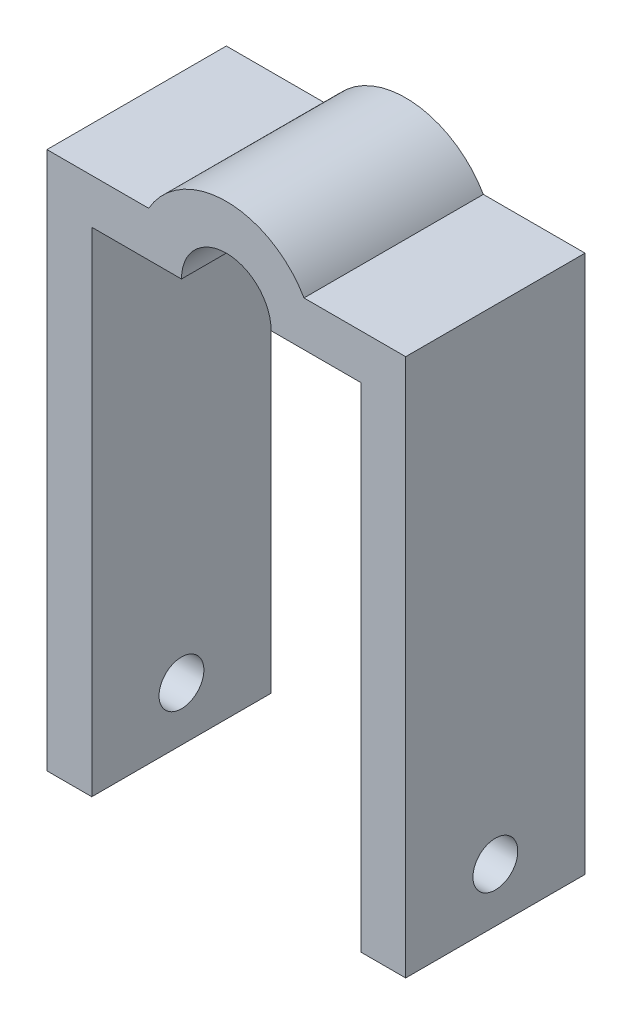
ISO-10303-21;
HEADER;
FILE_DESCRIPTION(('STEP AP214'),'2;1');
FILE_NAME('part.step','',(''),(''),'','','');
FILE_SCHEMA(('AUTOMOTIVE_DESIGN { 1 0 10303 214 1 1 1 1 }'));
ENDSEC;
DATA;
#1=APPLICATION_CONTEXT('core data for automotive mechanical design processes');
#2=APPLICATION_PROTOCOL_DEFINITION('international standard','automotive_design',2000,#1);
#3=PRODUCT_CONTEXT('',#1,'mechanical');
#4=PRODUCT('Part','Part','',(#3));
#5=PRODUCT_RELATED_PRODUCT_CATEGORY('part','',(#4));
#6=PRODUCT_DEFINITION_FORMATION('','',#4);
#7=PRODUCT_DEFINITION_CONTEXT('part definition',#1,'design');
#8=PRODUCT_DEFINITION('design','',#6,#7);
#9=PRODUCT_DEFINITION_SHAPE('','',#8);
#10=(LENGTH_UNIT() NAMED_UNIT(*) SI_UNIT(.MILLI.,.METRE.));
#11=(NAMED_UNIT(*) PLANE_ANGLE_UNIT() SI_UNIT($,.RADIAN.));
#12=(NAMED_UNIT(*) SI_UNIT($,.STERADIAN.) SOLID_ANGLE_UNIT());
#13=UNCERTAINTY_MEASURE_WITH_UNIT(LENGTH_MEASURE(1.E-05),#10,'distance_accuracy_value','');
#14=(GEOMETRIC_REPRESENTATION_CONTEXT(3) GLOBAL_UNCERTAINTY_ASSIGNED_CONTEXT((#13)) GLOBAL_UNIT_ASSIGNED_CONTEXT((#10,
#11,#12)) REPRESENTATION_CONTEXT('',''));
#15=CARTESIAN_POINT('',(0.,0.,0.));
#16=DIRECTION('',(0.,0.,1.));
#17=DIRECTION('',(1.,0.,0.));
#18=AXIS2_PLACEMENT_3D('',#15,#16,#17);
#19=CARTESIAN_POINT('',(-3.175,0.,12.7));
#20=DIRECTION('',(-1.,0.,0.));
#21=DIRECTION('',(0.,0.,1.));
#22=AXIS2_PLACEMENT_3D('',#19,#20,#21);
#23=PLANE('',#22);
#24=CARTESIAN_POINT('',(-3.175,3.81,6.35));
#25=DIRECTION('',(-1.,0.,0.));
#26=DIRECTION('',(0.,0.,1.));
#27=AXIS2_PLACEMENT_3D('',#24,#25,#26);
#28=CIRCLE('',#27,1.5875);
#29=CARTESIAN_POINT('',(-3.175,3.81,7.9375));
#30=VERTEX_POINT('',#29);
#31=EDGE_CURVE('E273',#30,#30,#28,.T.);
#32=ORIENTED_EDGE('',*,*,#31,.F.);
#33=EDGE_LOOP('',(#32));
#34=FACE_BOUND('',#33,.T.);
#35=DIRECTION('',(0.,1.,0.));
#36=VECTOR('',#35,1.);
#37=CARTESIAN_POINT('',(-3.175,0.,0.));
#38=LINE('',#37,#36);
#39=CARTESIAN_POINT('',(-3.175,0.,0.));
#40=VERTEX_POINT('',#39);
#41=CARTESIAN_POINT('',(-3.175,38.1,0.));
#42=VERTEX_POINT('',#41);
#43=EDGE_CURVE('E157',#40,#42,#38,.T.);
#44=ORIENTED_EDGE('',*,*,#43,.F.);
#45=DIRECTION('',(0.,0.,-1.));
#46=VECTOR('',#45,1.);
#47=CARTESIAN_POINT('',(-3.175,0.,12.7));
#48=LINE('',#47,#46);
#49=CARTESIAN_POINT('',(-3.175,0.,12.7));
#50=VERTEX_POINT('',#49);
#51=EDGE_CURVE('E11',#50,#40,#48,.T.);
#52=ORIENTED_EDGE('',*,*,#51,.F.);
#53=DIRECTION('',(0.,1.,0.));
#54=VECTOR('',#53,1.);
#55=CARTESIAN_POINT('',(-3.175,0.,12.7));
#56=LINE('',#55,#54);
#57=CARTESIAN_POINT('',(-3.175,38.1,12.7));
#58=VERTEX_POINT('',#57);
#59=EDGE_CURVE('E185',#50,#58,#56,.T.);
#60=ORIENTED_EDGE('',*,*,#59,.T.);
#61=DIRECTION('',(0.,0.,-1.));
#62=VECTOR('',#61,1.);
#63=CARTESIAN_POINT('',(-3.175,38.1,12.7));
#64=LINE('',#63,#62);
#65=EDGE_CURVE('E102',#58,#42,#64,.T.);
#66=ORIENTED_EDGE('',*,*,#65,.T.);
#67=EDGE_LOOP('',(#44,#52,#60,#66));
#68=FACE_BOUND('',#67,.T.);
#69=ADVANCED_FACE('F35',(#34,#68),#23,.T.);
#70=CARTESIAN_POINT('',(0.,0.,12.7));
#71=DIRECTION('',(0.,-1.,0.));
#72=DIRECTION('',(1.,0.,0.));
#73=AXIS2_PLACEMENT_3D('',#70,#71,#72);
#74=PLANE('',#73);
#75=DIRECTION('',(-1.,0.,0.));
#76=VECTOR('',#75,1.);
#77=CARTESIAN_POINT('',(0.,0.,0.));
#78=LINE('',#77,#76);
#79=CARTESIAN_POINT('',(0.,0.,0.));
#80=VERTEX_POINT('',#79);
#81=EDGE_CURVE('E183',#80,#40,#78,.T.);
#82=ORIENTED_EDGE('',*,*,#81,.F.);
#83=DIRECTION('',(0.,0.,-1.));
#84=VECTOR('',#83,1.);
#85=CARTESIAN_POINT('',(0.,0.,12.7));
#86=LINE('',#85,#84);
#87=CARTESIAN_POINT('',(0.,0.,12.7));
#88=VERTEX_POINT('',#87);
#89=EDGE_CURVE('E44',#88,#80,#86,.T.);
#90=ORIENTED_EDGE('',*,*,#89,.F.);
#91=DIRECTION('',(-1.,0.,0.));
#92=VECTOR('',#91,1.);
#93=CARTESIAN_POINT('',(0.,0.,12.7));
#94=LINE('',#93,#92);
#95=EDGE_CURVE('E137',#88,#50,#94,.T.);
#96=ORIENTED_EDGE('',*,*,#95,.T.);
#97=ORIENTED_EDGE('',*,*,#51,.T.);
#98=EDGE_LOOP('',(#82,#90,#96,#97));
#99=FACE_BOUND('',#98,.T.);
#100=ADVANCED_FACE('F212',(#99),#74,.T.);
#101=CARTESIAN_POINT('',(0.,0.,12.7));
#102=DIRECTION('',(-1.,0.,0.));
#103=DIRECTION('',(0.,0.,1.));
#104=AXIS2_PLACEMENT_3D('',#101,#102,#103);
#105=PLANE('',#104);
#106=CARTESIAN_POINT('',(0.,3.81,6.35));
#107=DIRECTION('',(-1.,0.,0.));
#108=DIRECTION('',(0.,0.,1.));
#109=AXIS2_PLACEMENT_3D('',#106,#107,#108);
#110=CIRCLE('',#109,1.5875);
#111=CARTESIAN_POINT('',(0.,3.81,7.9375));
#112=VERTEX_POINT('',#111);
#113=EDGE_CURVE('E161',#112,#112,#110,.T.);
#114=ORIENTED_EDGE('',*,*,#113,.T.);
#115=EDGE_LOOP('',(#114));
#116=FACE_BOUND('',#115,.T.);
#117=DIRECTION('',(0.,1.,0.));
#118=VECTOR('',#117,1.);
#119=CARTESIAN_POINT('',(0.,0.,0.));
#120=LINE('',#119,#118);
#121=CARTESIAN_POINT('',(0.,34.925,0.));
#122=VERTEX_POINT('',#121);
#123=EDGE_CURVE('E142',#80,#122,#120,.T.);
#124=ORIENTED_EDGE('',*,*,#123,.T.);
#125=DIRECTION('',(0.,0.,-1.));
#126=VECTOR('',#125,1.);
#127=CARTESIAN_POINT('',(0.,34.925,12.7));
#128=LINE('',#127,#126);
#129=CARTESIAN_POINT('',(0.,34.925,12.7));
#130=VERTEX_POINT('',#129);
#131=EDGE_CURVE('E140',#130,#122,#128,.T.);
#132=ORIENTED_EDGE('',*,*,#131,.F.);
#133=DIRECTION('',(0.,1.,0.));
#134=VECTOR('',#133,1.);
#135=CARTESIAN_POINT('',(0.,0.,12.7));
#136=LINE('',#135,#134);
#137=EDGE_CURVE('E130',#88,#130,#136,.T.);
#138=ORIENTED_EDGE('',*,*,#137,.F.);
#139=ORIENTED_EDGE('',*,*,#89,.T.);
#140=EDGE_LOOP('',(#124,#132,#138,#139));
#141=FACE_BOUND('',#140,.T.);
#142=ADVANCED_FACE('F141',(#116,#141),#105,.F.);
#143=CARTESIAN_POINT('',(0.,34.925,12.7));
#144=DIRECTION('',(0.,1.,0.));
#145=DIRECTION('',(-1.,0.,0.));
#146=AXIS2_PLACEMENT_3D('',#143,#144,#145);
#147=PLANE('',#146);
#148=DIRECTION('',(1.,0.,0.));
#149=VECTOR('',#148,1.);
#150=CARTESIAN_POINT('',(0.,34.925,0.));
#151=LINE('',#150,#149);
#152=CARTESIAN_POINT('',(6.35,34.925,0.));
#153=VERTEX_POINT('',#152);
#154=EDGE_CURVE('E180',#122,#153,#151,.T.);
#155=ORIENTED_EDGE('',*,*,#154,.T.);
#156=DIRECTION('',(0.,0.,-1.));
#157=VECTOR('',#156,1.);
#158=CARTESIAN_POINT('',(6.35,34.925,12.7));
#159=LINE('',#158,#157);
#160=CARTESIAN_POINT('',(6.35,34.925,12.7));
#161=VERTEX_POINT('',#160);
#162=EDGE_CURVE('E146',#161,#153,#159,.T.);
#163=ORIENTED_EDGE('',*,*,#162,.F.);
#164=DIRECTION('',(1.,0.,0.));
#165=VECTOR('',#164,1.);
#166=CARTESIAN_POINT('',(0.,34.925,12.7));
#167=LINE('',#166,#165);
#168=EDGE_CURVE('E135',#130,#161,#167,.T.);
#169=ORIENTED_EDGE('',*,*,#168,.F.);
#170=ORIENTED_EDGE('',*,*,#131,.T.);
#171=EDGE_LOOP('',(#155,#163,#169,#170));
#172=FACE_BOUND('',#171,.T.);
#173=ADVANCED_FACE('F148',(#172),#147,.F.);
#174=CARTESIAN_POINT('',(9.525,34.925,12.7));
#175=DIRECTION('',(0.,0.,-1.));
#176=DIRECTION('',(-1.,0.,0.));
#177=AXIS2_PLACEMENT_3D('',#174,#175,#176);
#178=CYLINDRICAL_SURFACE('',#177,3.175);
#179=CARTESIAN_POINT('',(9.525,34.925,0.));
#180=DIRECTION('',(0.,0.,1.));
#181=DIRECTION('',(1.,0.,0.));
#182=AXIS2_PLACEMENT_3D('',#179,#180,#181);
#183=CIRCLE('',#182,3.175);
#184=CARTESIAN_POINT('',(12.7,34.925,0.));
#185=VERTEX_POINT('',#184);
#186=EDGE_CURVE('E177',#185,#153,#183,.T.);
#187=ORIENTED_EDGE('',*,*,#186,.F.);
#188=DIRECTION('',(0.,0.,-1.));
#189=VECTOR('',#188,1.);
#190=CARTESIAN_POINT('',(12.7,34.925,12.7));
#191=LINE('',#190,#189);
#192=CARTESIAN_POINT('',(12.7,34.925,12.7));
#193=VERTEX_POINT('',#192);
#194=EDGE_CURVE('E189',#193,#185,#191,.T.);
#195=ORIENTED_EDGE('',*,*,#194,.F.);
#196=CARTESIAN_POINT('',(9.525,34.925,12.7));
#197=DIRECTION('',(0.,0.,1.));
#198=DIRECTION('',(1.,0.,0.));
#199=AXIS2_PLACEMENT_3D('',#196,#197,#198);
#200=CIRCLE('',#199,3.175);
#201=EDGE_CURVE('E150',#193,#161,#200,.T.);
#202=ORIENTED_EDGE('',*,*,#201,.T.);
#203=ORIENTED_EDGE('',*,*,#162,.T.);
#204=EDGE_LOOP('',(#187,#195,#202,#203));
#205=FACE_BOUND('',#204,.T.);
#206=ADVANCED_FACE('F227',(#205),#178,.F.);
#207=CARTESIAN_POINT('',(12.7,34.925,12.7));
#208=DIRECTION('',(0.,1.,0.));
#209=DIRECTION('',(-1.,0.,0.));
#210=AXIS2_PLACEMENT_3D('',#207,#208,#209);
#211=PLANE('',#210);
#212=DIRECTION('',(1.,0.,0.));
#213=VECTOR('',#212,1.);
#214=CARTESIAN_POINT('',(12.7,34.925,0.));
#215=LINE('',#214,#213);
#216=CARTESIAN_POINT('',(19.05,34.925,0.));
#217=VERTEX_POINT('',#216);
#218=EDGE_CURVE('E175',#185,#217,#215,.T.);
#219=ORIENTED_EDGE('',*,*,#218,.T.);
#220=DIRECTION('',(0.,0.,-1.));
#221=VECTOR('',#220,1.);
#222=CARTESIAN_POINT('',(19.05,34.925,12.7));
#223=LINE('',#222,#221);
#224=CARTESIAN_POINT('',(19.05,34.925,12.7));
#225=VERTEX_POINT('',#224);
#226=EDGE_CURVE('E191',#225,#217,#223,.T.);
#227=ORIENTED_EDGE('',*,*,#226,.F.);
#228=DIRECTION('',(1.,0.,0.));
#229=VECTOR('',#228,1.);
#230=CARTESIAN_POINT('',(12.7,34.925,12.7));
#231=LINE('',#230,#229);
#232=EDGE_CURVE('E152',#193,#225,#231,.T.);
#233=ORIENTED_EDGE('',*,*,#232,.F.);
#234=ORIENTED_EDGE('',*,*,#194,.T.);
#235=EDGE_LOOP('',(#219,#227,#233,#234));
#236=FACE_BOUND('',#235,.T.);
#237=ADVANCED_FACE('F230',(#236),#211,.F.);
#238=CARTESIAN_POINT('',(19.05,34.925,12.7));
#239=DIRECTION('',(1.,0.,0.));
#240=DIRECTION('',(0.,1.,0.));
#241=AXIS2_PLACEMENT_3D('',#238,#239,#240);
#242=PLANE('',#241);
#243=CARTESIAN_POINT('',(19.05,3.81,6.35));
#244=DIRECTION('',(1.,0.,0.));
#245=DIRECTION('',(0.,1.,0.));
#246=AXIS2_PLACEMENT_3D('',#243,#244,#245);
#247=CIRCLE('',#246,1.5875);
#248=CARTESIAN_POINT('',(19.05,3.81,7.9375));
#249=VERTEX_POINT('',#248);
#250=EDGE_CURVE('E276',#249,#249,#247,.T.);
#251=ORIENTED_EDGE('',*,*,#250,.T.);
#252=EDGE_LOOP('',(#251));
#253=FACE_BOUND('',#252,.T.);
#254=DIRECTION('',(0.,-1.,0.));
#255=VECTOR('',#254,1.);
#256=CARTESIAN_POINT('',(19.05,34.925,0.));
#257=LINE('',#256,#255);
#258=CARTESIAN_POINT('',(19.05,0.,0.));
#259=VERTEX_POINT('',#258);
#260=EDGE_CURVE('E173',#217,#259,#257,.T.);
#261=ORIENTED_EDGE('',*,*,#260,.T.);
#262=DIRECTION('',(0.,0.,-1.));
#263=VECTOR('',#262,1.);
#264=CARTESIAN_POINT('',(19.05,0.,12.7));
#265=LINE('',#264,#263);
#266=CARTESIAN_POINT('',(19.05,0.,12.7));
#267=VERTEX_POINT('',#266);
#268=EDGE_CURVE('E194',#267,#259,#265,.T.);
#269=ORIENTED_EDGE('',*,*,#268,.F.);
#270=DIRECTION('',(0.,-1.,0.));
#271=VECTOR('',#270,1.);
#272=CARTESIAN_POINT('',(19.05,34.925,12.7));
#273=LINE('',#272,#271);
#274=EDGE_CURVE('E293',#225,#267,#273,.T.);
#275=ORIENTED_EDGE('',*,*,#274,.F.);
#276=ORIENTED_EDGE('',*,*,#226,.T.);
#277=EDGE_LOOP('',(#261,#269,#275,#276));
#278=FACE_BOUND('',#277,.T.);
#279=ADVANCED_FACE('F234',(#253,#278),#242,.F.);
#280=CARTESIAN_POINT('',(19.05,0.,12.7));
#281=DIRECTION('',(0.,1.,0.));
#282=DIRECTION('',(0.,0.,1.));
#283=AXIS2_PLACEMENT_3D('',#280,#281,#282);
#284=PLANE('',#283);
#285=DIRECTION('',(1.,0.,0.));
#286=VECTOR('',#285,1.);
#287=CARTESIAN_POINT('',(19.05,0.,0.));
#288=LINE('',#287,#286);
#289=CARTESIAN_POINT('',(22.225,0.,0.));
#290=VERTEX_POINT('',#289);
#291=EDGE_CURVE('E171',#259,#290,#288,.T.);
#292=ORIENTED_EDGE('',*,*,#291,.T.);
#293=DIRECTION('',(0.,0.,-1.));
#294=VECTOR('',#293,1.);
#295=CARTESIAN_POINT('',(22.225,0.,12.7));
#296=LINE('',#295,#294);
#297=CARTESIAN_POINT('',(22.225,0.,12.7));
#298=VERTEX_POINT('',#297);
#299=EDGE_CURVE('E197',#298,#290,#296,.T.);
#300=ORIENTED_EDGE('',*,*,#299,.F.);
#301=DIRECTION('',(1.,0.,0.));
#302=VECTOR('',#301,1.);
#303=CARTESIAN_POINT('',(19.05,0.,12.7));
#304=LINE('',#303,#302);
#305=EDGE_CURVE('E291',#267,#298,#304,.T.);
#306=ORIENTED_EDGE('',*,*,#305,.F.);
#307=ORIENTED_EDGE('',*,*,#268,.T.);
#308=EDGE_LOOP('',(#292,#300,#306,#307));
#309=FACE_BOUND('',#308,.T.);
#310=ADVANCED_FACE('F238',(#309),#284,.F.);
#311=CARTESIAN_POINT('',(22.225,0.,12.7));
#312=DIRECTION('',(-1.,0.,0.));
#313=DIRECTION('',(0.,0.,1.));
#314=AXIS2_PLACEMENT_3D('',#311,#312,#313);
#315=PLANE('',#314);
#316=CARTESIAN_POINT('',(22.225,3.81,6.35));
#317=DIRECTION('',(-1.,0.,0.));
#318=DIRECTION('',(0.,0.,1.));
#319=AXIS2_PLACEMENT_3D('',#316,#317,#318);
#320=CIRCLE('',#319,1.5875);
#321=CARTESIAN_POINT('',(22.225,3.81,7.9375));
#322=VERTEX_POINT('',#321);
#323=EDGE_CURVE('E38',#322,#322,#320,.T.);
#324=ORIENTED_EDGE('',*,*,#323,.T.);
#325=EDGE_LOOP('',(#324));
#326=FACE_BOUND('',#325,.T.);
#327=DIRECTION('',(0.,1.,0.));
#328=VECTOR('',#327,1.);
#329=CARTESIAN_POINT('',(22.225,0.,0.));
#330=LINE('',#329,#328);
#331=CARTESIAN_POINT('',(22.225,38.1,0.));
#332=VERTEX_POINT('',#331);
#333=EDGE_CURVE('E169',#290,#332,#330,.T.);
#334=ORIENTED_EDGE('',*,*,#333,.T.);
#335=DIRECTION('',(0.,0.,-1.));
#336=VECTOR('',#335,1.);
#337=CARTESIAN_POINT('',(22.225,38.1,12.7));
#338=LINE('',#337,#336);
#339=CARTESIAN_POINT('',(22.225,38.1,12.7));
#340=VERTEX_POINT('',#339);
#341=EDGE_CURVE('E200',#340,#332,#338,.T.);
#342=ORIENTED_EDGE('',*,*,#341,.F.);
#343=DIRECTION('',(0.,1.,0.));
#344=VECTOR('',#343,1.);
#345=CARTESIAN_POINT('',(22.225,0.,12.7));
#346=LINE('',#345,#344);
#347=EDGE_CURVE('E289',#298,#340,#346,.T.);
#348=ORIENTED_EDGE('',*,*,#347,.F.);
#349=ORIENTED_EDGE('',*,*,#299,.T.);
#350=EDGE_LOOP('',(#334,#342,#348,#349));
#351=FACE_BOUND('',#350,.T.);
#352=ADVANCED_FACE('F242',(#326,#351),#315,.F.);
#353=CARTESIAN_POINT('',(22.225,38.1,12.7));
#354=DIRECTION('',(0.,-1.,0.));
#355=DIRECTION('',(1.,0.,0.));
#356=AXIS2_PLACEMENT_3D('',#353,#354,#355);
#357=PLANE('',#356);
#358=DIRECTION('',(-1.,0.,0.));
#359=VECTOR('',#358,1.);
#360=CARTESIAN_POINT('',(22.225,38.1,0.));
#361=LINE('',#360,#359);
#362=CARTESIAN_POINT('',(15.0242613140312,38.1,0.));
#363=VERTEX_POINT('',#362);
#364=EDGE_CURVE('E167',#332,#363,#361,.T.);
#365=ORIENTED_EDGE('',*,*,#364,.T.);
#366=DIRECTION('',(0.,0.,-1.));
#367=VECTOR('',#366,1.);
#368=CARTESIAN_POINT('',(15.0242613140312,38.1,12.7));
#369=LINE('',#368,#367);
#370=CARTESIAN_POINT('',(15.0242613140312,38.1,12.7));
#371=VERTEX_POINT('',#370);
#372=EDGE_CURVE('E203',#371,#363,#369,.T.);
#373=ORIENTED_EDGE('',*,*,#372,.F.);
#374=DIRECTION('',(-1.,0.,0.));
#375=VECTOR('',#374,1.);
#376=CARTESIAN_POINT('',(22.225,38.1,12.7));
#377=LINE('',#376,#375);
#378=EDGE_CURVE('E287',#340,#371,#377,.T.);
#379=ORIENTED_EDGE('',*,*,#378,.F.);
#380=ORIENTED_EDGE('',*,*,#341,.T.);
#381=EDGE_LOOP('',(#365,#373,#379,#380));
#382=FACE_BOUND('',#381,.T.);
#383=ADVANCED_FACE('F246',(#382),#357,.F.);
#384=CARTESIAN_POINT('',(9.525,34.925,12.7));
#385=DIRECTION('',(0.,0.,-1.));
#386=DIRECTION('',(-1.,0.,0.));
#387=AXIS2_PLACEMENT_3D('',#384,#385,#386);
#388=CYLINDRICAL_SURFACE('',#387,6.35);
#389=CARTESIAN_POINT('',(9.525,34.925,0.));
#390=DIRECTION('',(0.,0.,1.));
#391=DIRECTION('',(1.,0.,0.));
#392=AXIS2_PLACEMENT_3D('',#389,#390,#391);
#393=CIRCLE('',#392,6.35);
#394=CARTESIAN_POINT('',(4.02573868596882,38.1,0.));
#395=VERTEX_POINT('',#394);
#396=EDGE_CURVE('E164',#363,#395,#393,.T.);
#397=ORIENTED_EDGE('',*,*,#396,.T.);
#398=DIRECTION('',(0.,0.,-1.));
#399=VECTOR('',#398,1.);
#400=CARTESIAN_POINT('',(4.02573868596882,38.1,12.7));
#401=LINE('',#400,#399);
#402=CARTESIAN_POINT('',(4.02573868596882,38.1,12.7));
#403=VERTEX_POINT('',#402);
#404=EDGE_CURVE('E206',#403,#395,#401,.T.);
#405=ORIENTED_EDGE('',*,*,#404,.F.);
#406=CARTESIAN_POINT('',(9.525,34.925,12.7));
#407=DIRECTION('',(0.,0.,1.));
#408=DIRECTION('',(1.,0.,0.));
#409=AXIS2_PLACEMENT_3D('',#406,#407,#408);
#410=CIRCLE('',#409,6.35);
#411=EDGE_CURVE('E285',#371,#403,#410,.T.);
#412=ORIENTED_EDGE('',*,*,#411,.F.);
#413=ORIENTED_EDGE('',*,*,#372,.T.);
#414=EDGE_LOOP('',(#397,#405,#412,#413));
#415=FACE_BOUND('',#414,.T.);
#416=ADVANCED_FACE('F250',(#415),#388,.T.);
#417=CARTESIAN_POINT('',(-3.175,38.1,12.7));
#418=DIRECTION('',(0.,1.,0.));
#419=DIRECTION('',(-1.,0.,0.));
#420=AXIS2_PLACEMENT_3D('',#417,#418,#419);
#421=PLANE('',#420);
#422=DIRECTION('',(1.,0.,0.));
#423=VECTOR('',#422,1.);
#424=CARTESIAN_POINT('',(-3.175,38.1,0.));
#425=LINE('',#424,#423);
#426=EDGE_CURVE('E160',#42,#395,#425,.T.);
#427=ORIENTED_EDGE('',*,*,#426,.F.);
#428=ORIENTED_EDGE('',*,*,#65,.F.);
#429=DIRECTION('',(1.,0.,0.));
#430=VECTOR('',#429,1.);
#431=CARTESIAN_POINT('',(-3.175,38.1,12.7));
#432=LINE('',#431,#430);
#433=EDGE_CURVE('E283',#58,#403,#432,.T.);
#434=ORIENTED_EDGE('',*,*,#433,.T.);
#435=ORIENTED_EDGE('',*,*,#404,.T.);
#436=EDGE_LOOP('',(#427,#428,#434,#435));
#437=FACE_BOUND('',#436,.T.);
#438=ADVANCED_FACE('F207',(#437),#421,.T.);
#439=CARTESIAN_POINT('',(9.525,34.925,12.7));
#440=DIRECTION('',(0.,0.,1.));
#441=DIRECTION('',(1.,0.,0.));
#442=AXIS2_PLACEMENT_3D('',#439,#440,#441);
#443=PLANE('',#442);
#444=ORIENTED_EDGE('',*,*,#59,.F.);
#445=ORIENTED_EDGE('',*,*,#95,.F.);
#446=ORIENTED_EDGE('',*,*,#137,.T.);
#447=ORIENTED_EDGE('',*,*,#168,.T.);
#448=ORIENTED_EDGE('',*,*,#201,.F.);
#449=ORIENTED_EDGE('',*,*,#232,.T.);
#450=ORIENTED_EDGE('',*,*,#274,.T.);
#451=ORIENTED_EDGE('',*,*,#305,.T.);
#452=ORIENTED_EDGE('',*,*,#347,.T.);
#453=ORIENTED_EDGE('',*,*,#378,.T.);
#454=ORIENTED_EDGE('',*,*,#411,.T.);
#455=ORIENTED_EDGE('',*,*,#433,.F.);
#456=EDGE_LOOP('',(#444,#445,#446,#447,#448,#449,#450,#451,#452,#453,#454,#455));
#457=FACE_BOUND('',#456,.T.);
#458=ADVANCED_FACE('F132',(#457),#443,.T.);
#459=CARTESIAN_POINT('',(9.525,34.925,0.));
#460=DIRECTION('',(0.,0.,1.));
#461=DIRECTION('',(1.,0.,0.));
#462=AXIS2_PLACEMENT_3D('',#459,#460,#461);
#463=PLANE('',#462);
#464=ORIENTED_EDGE('',*,*,#43,.T.);
#465=ORIENTED_EDGE('',*,*,#426,.T.);
#466=ORIENTED_EDGE('',*,*,#396,.F.);
#467=ORIENTED_EDGE('',*,*,#364,.F.);
#468=ORIENTED_EDGE('',*,*,#333,.F.);
#469=ORIENTED_EDGE('',*,*,#291,.F.);
#470=ORIENTED_EDGE('',*,*,#260,.F.);
#471=ORIENTED_EDGE('',*,*,#218,.F.);
#472=ORIENTED_EDGE('',*,*,#186,.T.);
#473=ORIENTED_EDGE('',*,*,#154,.F.);
#474=ORIENTED_EDGE('',*,*,#123,.F.);
#475=ORIENTED_EDGE('',*,*,#81,.T.);
#476=EDGE_LOOP('',(#464,#465,#466,#467,#468,#469,#470,#471,#472,#473,#474,#475));
#477=FACE_BOUND('',#476,.T.);
#478=ADVANCED_FACE('F211',(#477),#463,.F.);
#479=CARTESIAN_POINT('',(73.025,3.81,6.35));
#480=DIRECTION('',(-1.,0.,0.));
#481=DIRECTION('',(0.,0.,1.));
#482=AXIS2_PLACEMENT_3D('',#479,#480,#481);
#483=CYLINDRICAL_SURFACE('',#482,1.5875);
#484=CARTESIAN_POINT('',(22.225,3.81,7.9375));
#485=CARTESIAN_POINT('',(22.1919270833333,3.81,7.9375));
#486=CARTESIAN_POINT('',(22.1588541666667,3.81,7.9375));
#487=CARTESIAN_POINT('',(22.0927083333333,3.81,7.9375));
#488=CARTESIAN_POINT('',(22.0596354166667,3.81,7.9375));
#489=CARTESIAN_POINT('',(21.9934895833333,3.81,7.9375));
#490=CARTESIAN_POINT('',(21.9604166666667,3.81,7.9375));
#491=CARTESIAN_POINT('',(21.8942708333333,3.81,7.9375));
#492=CARTESIAN_POINT('',(21.8611979166667,3.81,7.9375));
#493=CARTESIAN_POINT('',(21.7950520833333,3.81,7.9375));
#494=CARTESIAN_POINT('',(21.7619791666667,3.81,7.9375));
#495=CARTESIAN_POINT('',(21.6958333333333,3.81,7.9375));
#496=CARTESIAN_POINT('',(21.6627604166667,3.81,7.9375));
#497=CARTESIAN_POINT('',(21.5966145833333,3.81,7.9375));
#498=CARTESIAN_POINT('',(21.5635416666667,3.81,7.9375));
#499=CARTESIAN_POINT('',(21.4973958333333,3.81,7.9375));
#500=CARTESIAN_POINT('',(21.4643229166667,3.81,7.9375));
#501=CARTESIAN_POINT('',(21.3981770833333,3.81,7.9375));
#502=CARTESIAN_POINT('',(21.3651041666667,3.81,7.9375));
#503=CARTESIAN_POINT('',(21.2989583333333,3.81,7.9375));
#504=CARTESIAN_POINT('',(21.2658854166667,3.81,7.9375));
#505=CARTESIAN_POINT('',(21.1997395833333,3.81,7.9375));
#506=CARTESIAN_POINT('',(21.1666666666667,3.81,7.9375));
#507=CARTESIAN_POINT('',(21.1005208333333,3.81,7.9375));
#508=CARTESIAN_POINT('',(21.0674479166667,3.81,7.9375));
#509=CARTESIAN_POINT('',(21.0013020833333,3.81,7.9375));
#510=CARTESIAN_POINT('',(20.9682291666667,3.81,7.9375));
#511=CARTESIAN_POINT('',(20.9020833333333,3.81,7.9375));
#512=CARTESIAN_POINT('',(20.8690104166667,3.81,7.9375));
#513=CARTESIAN_POINT('',(20.8028645833333,3.81,7.9375));
#514=CARTESIAN_POINT('',(20.7697916666667,3.81,7.9375));
#515=CARTESIAN_POINT('',(20.7036458333333,3.81,7.9375));
#516=CARTESIAN_POINT('',(20.6705729166667,3.81,7.9375));
#517=CARTESIAN_POINT('',(20.6044270833333,3.81,7.9375));
#518=CARTESIAN_POINT('',(20.5713541666667,3.81,7.9375));
#519=CARTESIAN_POINT('',(20.5052083333333,3.81,7.9375));
#520=CARTESIAN_POINT('',(20.4721354166667,3.81,7.9375));
#521=CARTESIAN_POINT('',(20.4059895833333,3.81,7.9375));
#522=CARTESIAN_POINT('',(20.3729166666667,3.81,7.9375));
#523=CARTESIAN_POINT('',(20.3067708333333,3.81,7.9375));
#524=CARTESIAN_POINT('',(20.2736979166667,3.81,7.9375));
#525=CARTESIAN_POINT('',(20.2075520833333,3.81,7.9375));
#526=CARTESIAN_POINT('',(20.1744791666667,3.81,7.9375));
#527=CARTESIAN_POINT('',(20.1083333333333,3.81,7.9375));
#528=CARTESIAN_POINT('',(20.0752604166667,3.81,7.9375));
#529=CARTESIAN_POINT('',(20.0091145833333,3.81,7.9375));
#530=CARTESIAN_POINT('',(19.9760416666667,3.81,7.9375));
#531=CARTESIAN_POINT('',(19.9098958333333,3.81,7.9375));
#532=CARTESIAN_POINT('',(19.8768229166667,3.81,7.9375));
#533=CARTESIAN_POINT('',(19.8106770833333,3.81,7.9375));
#534=CARTESIAN_POINT('',(19.7776041666667,3.81,7.9375));
#535=CARTESIAN_POINT('',(19.7114583333333,3.81,7.9375));
#536=CARTESIAN_POINT('',(19.6783854166667,3.81,7.9375));
#537=CARTESIAN_POINT('',(19.6122395833333,3.81,7.9375));
#538=CARTESIAN_POINT('',(19.5791666666667,3.81,7.9375));
#539=CARTESIAN_POINT('',(19.5130208333333,3.81,7.9375));
#540=CARTESIAN_POINT('',(19.4799479166667,3.81,7.9375));
#541=CARTESIAN_POINT('',(19.4138020833333,3.81,7.9375));
#542=CARTESIAN_POINT('',(19.3807291666667,3.81,7.9375));
#543=CARTESIAN_POINT('',(19.3145833333333,3.81,7.9375));
#544=CARTESIAN_POINT('',(19.2815104166667,3.81,7.9375));
#545=CARTESIAN_POINT('',(19.2153645833333,3.81,7.9375));
#546=CARTESIAN_POINT('',(19.1822916666667,3.81,7.9375));
#547=CARTESIAN_POINT('',(19.1161458333333,3.81,7.9375));
#548=CARTESIAN_POINT('',(19.0830729166667,3.81,7.9375));
#549=CARTESIAN_POINT('',(19.05,3.81,7.9375));
#550=B_SPLINE_CURVE_WITH_KNOTS('',3,(#484,#485,#486,#487,#488,#489,#490,#491,#492,#493,#494,
#495,#496,#497,#498,#499,#500,#501,#502,#503,#504,#505,#506,#507,#508,#509,#510,#511,#512,#513,
#514,#515,#516,#517,#518,#519,#520,#521,#522,#523,#524,#525,#526,#527,#528,#529,#530,#531,#532,
#533,#534,#535,#536,#537,#538,#539,#540,#541,#542,#543,#544,#545,#546,#547,#548,#549),
.UNSPECIFIED.,.F.,.F.,(4,2,2,2,2,2,2,2,2,2,2,2,2,2,2,2,2,2,2,2,2,2,2,2,2,2,2,2,2,2,2,2,4),(0.,
0.0992187499999977,0.198437500000002,0.29765625,0.396875000000005,0.496093750000003,0.5953125,
0.694531250000005,0.793750000000003,0.892968750000001,0.992187500000005,1.09140625,1.190625,
1.28984375000001,1.3890625,1.48828125000001,1.58750000000001,1.68671875,1.78593750000001,
1.88515625000001,1.98437500000001,2.08359375000001,2.18281250000001,2.28203125000001,
2.38125000000001,2.48046875000001,2.57968750000001,2.67890625000001,2.77812500000001,
2.87734375000001,2.97656250000001,3.07578125000001,3.17500000000001),.UNSPECIFIED.);
#551=EDGE_CURVE('BSEAM261',#322,#249,#550,.T.);
#552=ORIENTED_EDGE('',*,*,#323,.F.);
#553=ORIENTED_EDGE('',*,*,#250,.F.);
#554=ORIENTED_EDGE('',*,*,#551,.T.);
#555=ORIENTED_EDGE('',*,*,#551,.F.);
#556=EDGE_LOOP('',(#552,#554,#553,#555));
#557=FACE_BOUND('',#556,.T.);
#558=ADVANCED_FACE('F261',(#557),#483,.F.);
#559=CARTESIAN_POINT('',(-3.175,3.81,7.9375));
#560=CARTESIAN_POINT('',(-3.14192708333333,3.81,7.9375));
#561=CARTESIAN_POINT('',(-3.10885416666666,3.81,7.9375));
#562=CARTESIAN_POINT('',(-3.04270833333333,3.81,7.9375));
#563=CARTESIAN_POINT('',(-3.00963541666667,3.81,7.9375));
#564=CARTESIAN_POINT('',(-2.94348958333333,3.81,7.9375));
#565=CARTESIAN_POINT('',(-2.91041666666667,3.81,7.9375));
#566=CARTESIAN_POINT('',(-2.84427083333333,3.81,7.9375));
#567=CARTESIAN_POINT('',(-2.81119791666666,3.81,7.9375));
#568=CARTESIAN_POINT('',(-2.74505208333333,3.81,7.9375));
#569=CARTESIAN_POINT('',(-2.71197916666667,3.81,7.9375));
#570=CARTESIAN_POINT('',(-2.64583333333333,3.81,7.9375));
#571=CARTESIAN_POINT('',(-2.61276041666667,3.81,7.9375));
#572=CARTESIAN_POINT('',(-2.54661458333333,3.81,7.9375));
#573=CARTESIAN_POINT('',(-2.51354166666666,3.81,7.9375));
#574=CARTESIAN_POINT('',(-2.44739583333332,3.81,7.9375));
#575=CARTESIAN_POINT('',(-2.41432291666666,3.81,7.9375));
#576=CARTESIAN_POINT('',(-2.34817708333332,3.81,7.9375));
#577=CARTESIAN_POINT('',(-2.31510416666666,3.81,7.9375));
#578=CARTESIAN_POINT('',(-2.24895833333333,3.81,7.9375));
#579=CARTESIAN_POINT('',(-2.21588541666666,3.81,7.9375));
#580=CARTESIAN_POINT('',(-2.14973958333332,3.81,7.9375));
#581=CARTESIAN_POINT('',(-2.11666666666666,3.81,7.9375));
#582=CARTESIAN_POINT('',(-2.05052083333332,3.81,7.9375));
#583=CARTESIAN_POINT('',(-2.01744791666666,3.81,7.9375));
#584=CARTESIAN_POINT('',(-1.95130208333333,3.81,7.9375));
#585=CARTESIAN_POINT('',(-1.91822916666666,3.81,7.9375));
#586=CARTESIAN_POINT('',(-1.85208333333332,3.81,7.9375));
#587=CARTESIAN_POINT('',(-1.81901041666666,3.81,7.9375));
#588=CARTESIAN_POINT('',(-1.75286458333332,3.81,7.9375));
#589=CARTESIAN_POINT('',(-1.71979166666666,3.81,7.9375));
#590=CARTESIAN_POINT('',(-1.65364583333333,3.81,7.9375));
#591=CARTESIAN_POINT('',(-1.62057291666666,3.81,7.9375));
#592=CARTESIAN_POINT('',(-1.55442708333332,3.81,7.9375));
#593=CARTESIAN_POINT('',(-1.52135416666666,3.81,7.9375));
#594=CARTESIAN_POINT('',(-1.45520833333332,3.81,7.9375));
#595=CARTESIAN_POINT('',(-1.42213541666666,3.81,7.9375));
#596=CARTESIAN_POINT('',(-1.35598958333333,3.81,7.9375));
#597=CARTESIAN_POINT('',(-1.32291666666666,3.81,7.9375));
#598=CARTESIAN_POINT('',(-1.25677083333332,3.81,7.9375));
#599=CARTESIAN_POINT('',(-1.22369791666666,3.81,7.9375));
#600=CARTESIAN_POINT('',(-1.15755208333332,3.81,7.9375));
#601=CARTESIAN_POINT('',(-1.12447916666666,3.81,7.9375));
#602=CARTESIAN_POINT('',(-1.05833333333333,3.81,7.9375));
#603=CARTESIAN_POINT('',(-1.02526041666666,3.81,7.9375));
#604=CARTESIAN_POINT('',(-0.959114583333323,3.81,7.9375));
#605=CARTESIAN_POINT('',(-0.926041666666655,3.81,7.9375));
#606=CARTESIAN_POINT('',(-0.859895833333323,3.81,7.9375));
#607=CARTESIAN_POINT('',(-0.826822916666659,3.81,7.9375));
#608=CARTESIAN_POINT('',(-0.760677083333328,3.81,7.9375));
#609=CARTESIAN_POINT('',(-0.727604166666659,3.81,7.9375));
#610=CARTESIAN_POINT('',(-0.661458333333323,3.81,7.9375));
#611=CARTESIAN_POINT('',(-0.628385416666655,3.81,7.9375));
#612=CARTESIAN_POINT('',(-0.562239583333318,3.81,7.9375));
#613=CARTESIAN_POINT('',(-0.52916666666665,3.81,7.9375));
#614=CARTESIAN_POINT('',(-0.463020833333318,3.81,7.9375));
#615=CARTESIAN_POINT('',(-0.429947916666655,3.81,7.9375));
#616=CARTESIAN_POINT('',(-0.363802083333323,3.81,7.9375));
#617=CARTESIAN_POINT('',(-0.330729166666655,3.81,7.9375));
#618=CARTESIAN_POINT('',(-0.264583333333318,3.81,7.9375));
#619=CARTESIAN_POINT('',(-0.23151041666665,3.81,7.9375));
#620=CARTESIAN_POINT('',(-0.165364583333318,3.81,7.9375));
#621=CARTESIAN_POINT('',(-0.132291666666654,3.81,7.9375));
#622=CARTESIAN_POINT('',(-0.0661458333333226,3.81,7.9375));
#623=CARTESIAN_POINT('',(-0.0330729166666544,3.81,7.9375));
#624=CARTESIAN_POINT('',(0.,3.81,7.9375));
#625=B_SPLINE_CURVE_WITH_KNOTS('',3,(#559,#560,#561,#562,#563,#564,#565,#566,#567,#568,#569,
#570,#571,#572,#573,#574,#575,#576,#577,#578,#579,#580,#581,#582,#583,#584,#585,#586,#587,#588,
#589,#590,#591,#592,#593,#594,#595,#596,#597,#598,#599,#600,#601,#602,#603,#604,#605,#606,#607,
#608,#609,#610,#611,#612,#613,#614,#615,#616,#617,#618,#619,#620,#621,#622,#623,#624),
.UNSPECIFIED.,.F.,.F.,(4,2,2,2,2,2,2,2,2,2,2,2,2,2,2,2,2,2,2,2,2,2,2,2,2,2,2,2,2,2,2,2,4),(0.,
0.0992187500000047,0.198437499999995,0.29765625,0.396875000000005,0.496093749999996,0.5953125,
0.694531250000005,0.79375000000001,0.892968750000001,0.992187500000005,1.09140625000001,
1.190625,1.28984375000001,1.38906250000001,1.48828125,1.58750000000001,1.68671875000001,
1.7859375,1.88515625000001,1.98437500000001,2.08359375,2.18281250000001,2.28203125000001,
2.38125,2.48046875000001,2.57968750000001,2.67890625000002,2.77812500000001,2.87734375000001,
2.97656250000002,3.07578125000001,3.17500000000001),.UNSPECIFIED.);
#626=EDGE_CURVE('BSEAM263',#30,#112,#625,.T.);
#627=ORIENTED_EDGE('',*,*,#31,.T.);
#628=ORIENTED_EDGE('',*,*,#113,.F.);
#629=ORIENTED_EDGE('',*,*,#626,.T.);
#630=ORIENTED_EDGE('',*,*,#626,.F.);
#631=EDGE_LOOP('',(#627,#629,#628,#630));
#632=FACE_BOUND('',#631,.T.);
#633=ADVANCED_FACE('F263',(#632),#483,.F.);
#634=CLOSED_SHELL('',(#69,#100,#142,#173,#206,#237,#279,#310,#352,#383,#416,#438,#458,#478,#558,#633));
#635=MANIFOLD_SOLID_BREP('B2',#634);
#636=ADVANCED_BREP_SHAPE_REPRESENTATION('',(#18,#635),#14);
#637=SHAPE_DEFINITION_REPRESENTATION(#9,#636);
ENDSEC;
END-ISO-10303-21;
